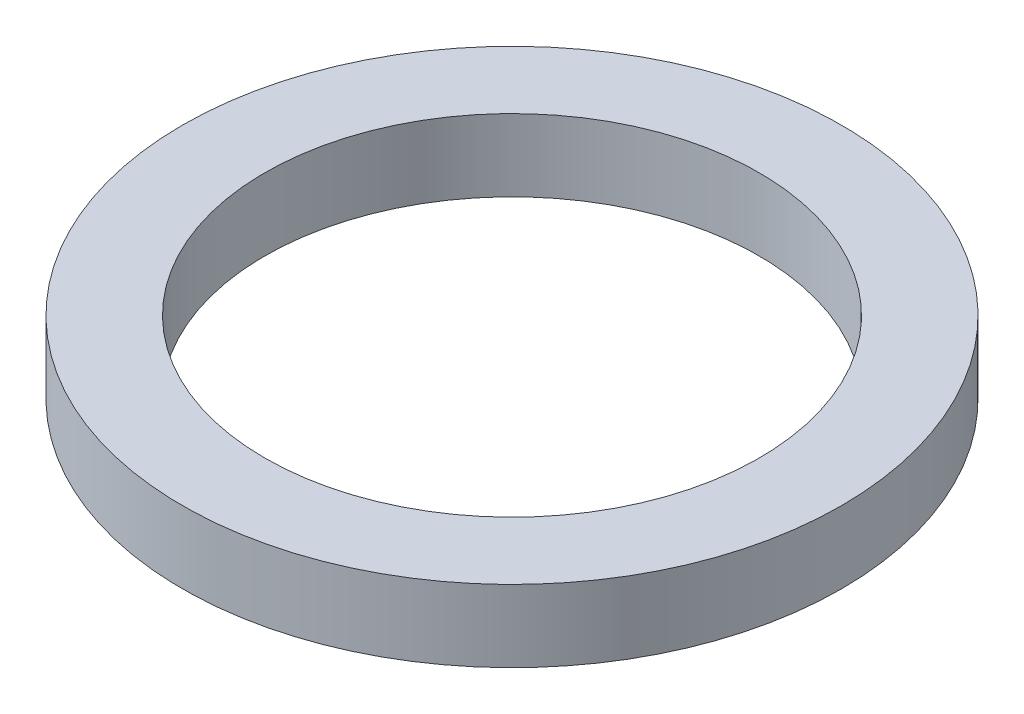
ISO-10303-21;
HEADER;
FILE_DESCRIPTION(('STEP AP214'),'2;1');
FILE_NAME('part.step','',(''),(''),'','','');
FILE_SCHEMA(('AUTOMOTIVE_DESIGN { 1 0 10303 214 1 1 1 1 }'));
ENDSEC;
DATA;
#1=APPLICATION_CONTEXT('core data for automotive mechanical design processes');
#2=APPLICATION_PROTOCOL_DEFINITION('international standard','automotive_design',2000,#1);
#3=PRODUCT_CONTEXT('',#1,'mechanical');
#4=PRODUCT('Part','Part','',(#3));
#5=PRODUCT_RELATED_PRODUCT_CATEGORY('part','',(#4));
#6=PRODUCT_DEFINITION_FORMATION('','',#4);
#7=PRODUCT_DEFINITION_CONTEXT('part definition',#1,'design');
#8=PRODUCT_DEFINITION('design','',#6,#7);
#9=PRODUCT_DEFINITION_SHAPE('','',#8);
#10=(LENGTH_UNIT() NAMED_UNIT(*) SI_UNIT(.MILLI.,.METRE.));
#11=(NAMED_UNIT(*) PLANE_ANGLE_UNIT() SI_UNIT($,.RADIAN.));
#12=(NAMED_UNIT(*) SI_UNIT($,.STERADIAN.) SOLID_ANGLE_UNIT());
#13=UNCERTAINTY_MEASURE_WITH_UNIT(LENGTH_MEASURE(1.E-05),#10,'distance_accuracy_value','');
#14=(GEOMETRIC_REPRESENTATION_CONTEXT(3) GLOBAL_UNCERTAINTY_ASSIGNED_CONTEXT((#13)) GLOBAL_UNIT_ASSIGNED_CONTEXT((#10,
#11,#12)) REPRESENTATION_CONTEXT('',''));
#15=CARTESIAN_POINT('',(0.,0.,0.));
#16=DIRECTION('',(0.,0.,1.));
#17=DIRECTION('',(1.,0.,0.));
#18=AXIS2_PLACEMENT_3D('',#15,#16,#17);
#19=CARTESIAN_POINT('',(0.,1.75,0.));
#20=DIRECTION('',(0.,1.,0.));
#21=DIRECTION('',(0.,0.,1.));
#22=AXIS2_PLACEMENT_3D('',#19,#20,#21);
#23=PLANE('',#22);
#24=CARTESIAN_POINT('',(0.,1.75,0.));
#25=DIRECTION('',(0.,1.,0.));
#26=DIRECTION('',(1.,0.,0.));
#27=AXIS2_PLACEMENT_3D('',#24,#25,#26);
#28=CIRCLE('',#27,8.);
#29=CARTESIAN_POINT('',(8.,1.75,0.));
#30=VERTEX_POINT('',#29);
#31=EDGE_CURVE('E11',#30,#30,#28,.T.);
#32=ORIENTED_EDGE('',*,*,#31,.T.);
#33=EDGE_LOOP('',(#32));
#34=FACE_BOUND('',#33,.T.);
#35=CARTESIAN_POINT('',(0.,1.75,0.));
#36=DIRECTION('',(0.,1.,0.));
#37=DIRECTION('',(0.,0.,1.));
#38=AXIS2_PLACEMENT_3D('',#35,#36,#37);
#39=CIRCLE('',#38,6.);
#40=CARTESIAN_POINT('',(0.,1.75,6.));
#41=VERTEX_POINT('',#40);
#42=EDGE_CURVE('E48',#41,#41,#39,.T.);
#43=ORIENTED_EDGE('',*,*,#42,.F.);
#44=EDGE_LOOP('',(#43));
#45=FACE_BOUND('',#44,.T.);
#46=ADVANCED_FACE('F37',(#34,#45),#23,.T.);
#47=CARTESIAN_POINT('',(0.,0.,0.));
#48=DIRECTION('',(0.,1.,0.));
#49=DIRECTION('',(0.,0.,1.));
#50=AXIS2_PLACEMENT_3D('',#47,#48,#49);
#51=PLANE('',#50);
#52=CARTESIAN_POINT('',(0.,0.,0.));
#53=DIRECTION('',(0.,1.,0.));
#54=DIRECTION('',(1.,0.,0.));
#55=AXIS2_PLACEMENT_3D('',#52,#53,#54);
#56=CIRCLE('',#55,8.);
#57=CARTESIAN_POINT('',(8.,0.,0.));
#58=VERTEX_POINT('',#57);
#59=EDGE_CURVE('E41',#58,#58,#56,.T.);
#60=ORIENTED_EDGE('',*,*,#59,.F.);
#61=EDGE_LOOP('',(#60));
#62=FACE_BOUND('',#61,.T.);
#63=CARTESIAN_POINT('',(0.,0.,0.));
#64=DIRECTION('',(0.,1.,0.));
#65=DIRECTION('',(0.,0.,1.));
#66=AXIS2_PLACEMENT_3D('',#63,#64,#65);
#67=CIRCLE('',#66,6.);
#68=CARTESIAN_POINT('',(0.,0.,6.));
#69=VERTEX_POINT('',#68);
#70=EDGE_CURVE('E50',#69,#69,#67,.T.);
#71=ORIENTED_EDGE('',*,*,#70,.T.);
#72=EDGE_LOOP('',(#71));
#73=FACE_BOUND('',#72,.T.);
#74=ADVANCED_FACE('F60',(#62,#73),#51,.F.);
#75=CARTESIAN_POINT('',(0.,1.75,0.));
#76=DIRECTION('',(0.,-1.,0.));
#77=DIRECTION('',(0.,0.,-1.));
#78=AXIS2_PLACEMENT_3D('',#75,#76,#77);
#79=CYLINDRICAL_SURFACE('',#78,8.);
#80=ORIENTED_EDGE('',*,*,#31,.F.);
#81=EDGE_LOOP('',(#80));
#82=FACE_BOUND('',#81,.T.);
#83=ORIENTED_EDGE('',*,*,#59,.T.);
#84=EDGE_LOOP('',(#83));
#85=FACE_BOUND('',#84,.T.);
#86=ADVANCED_FACE('F39',(#82,#85),#79,.T.);
#87=CARTESIAN_POINT('',(0.,1.75,0.));
#88=DIRECTION('',(0.,-1.,0.));
#89=DIRECTION('',(0.,0.,-1.));
#90=AXIS2_PLACEMENT_3D('',#87,#88,#89);
#91=CYLINDRICAL_SURFACE('',#90,6.);
#92=ORIENTED_EDGE('',*,*,#42,.T.);
#93=EDGE_LOOP('',(#92));
#94=FACE_BOUND('',#93,.T.);
#95=ORIENTED_EDGE('',*,*,#70,.F.);
#96=EDGE_LOOP('',(#95));
#97=FACE_BOUND('',#96,.T.);
#98=ADVANCED_FACE('F56',(#94,#97),#91,.F.);
#99=CLOSED_SHELL('',(#46,#74,#86,#98));
#100=MANIFOLD_SOLID_BREP('B2',#99);
#101=ADVANCED_BREP_SHAPE_REPRESENTATION('',(#18,#100),#14);
#102=SHAPE_DEFINITION_REPRESENTATION(#9,#101);
ENDSEC;
END-ISO-10303-21;
